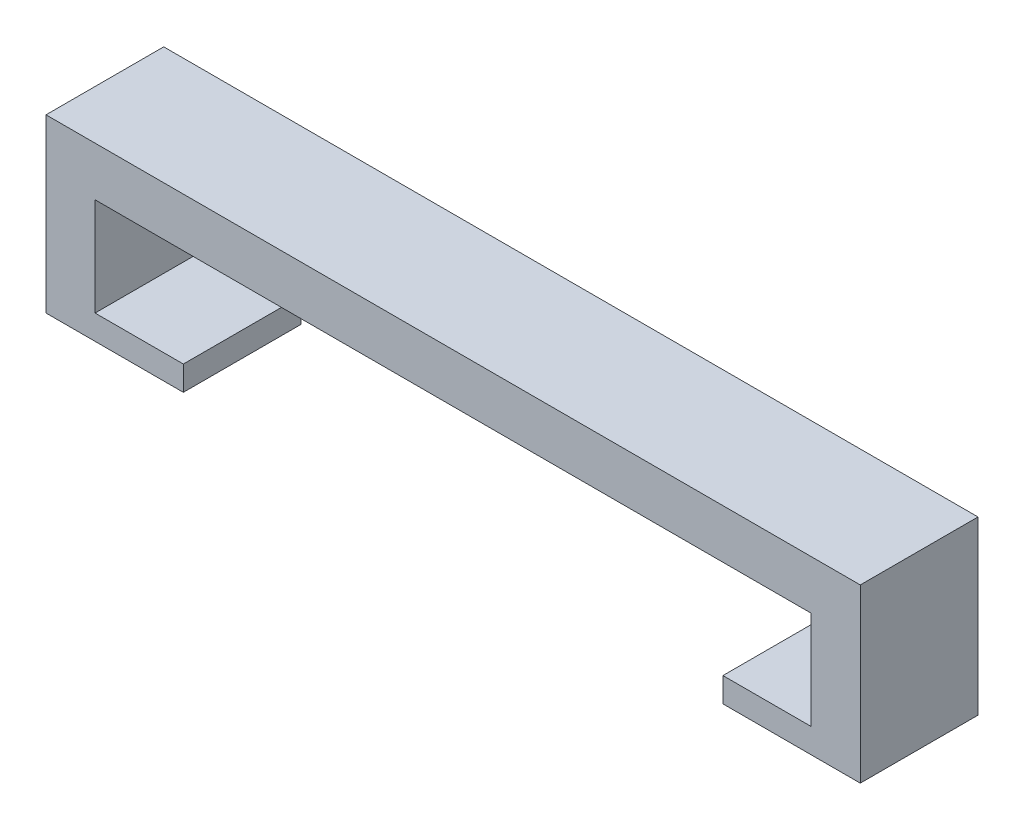
ISO-10303-21;
HEADER;
FILE_DESCRIPTION(('STEP AP214'),'2;1');
FILE_NAME('part.step','',(''),(''),'','','');
FILE_SCHEMA(('AUTOMOTIVE_DESIGN { 1 0 10303 214 1 1 1 1 }'));
ENDSEC;
DATA;
#1=APPLICATION_CONTEXT('core data for automotive mechanical design processes');
#2=APPLICATION_PROTOCOL_DEFINITION('international standard','automotive_design',2000,#1);
#3=PRODUCT_CONTEXT('',#1,'mechanical');
#4=PRODUCT('Part','Part','',(#3));
#5=PRODUCT_RELATED_PRODUCT_CATEGORY('part','',(#4));
#6=PRODUCT_DEFINITION_FORMATION('','',#4);
#7=PRODUCT_DEFINITION_CONTEXT('part definition',#1,'design');
#8=PRODUCT_DEFINITION('design','',#6,#7);
#9=PRODUCT_DEFINITION_SHAPE('','',#8);
#10=(LENGTH_UNIT() NAMED_UNIT(*) SI_UNIT(.MILLI.,.METRE.));
#11=(NAMED_UNIT(*) PLANE_ANGLE_UNIT() SI_UNIT($,.RADIAN.));
#12=(NAMED_UNIT(*) SI_UNIT($,.STERADIAN.) SOLID_ANGLE_UNIT());
#13=UNCERTAINTY_MEASURE_WITH_UNIT(LENGTH_MEASURE(1.E-05),#10,'distance_accuracy_value','');
#14=(GEOMETRIC_REPRESENTATION_CONTEXT(3) GLOBAL_UNCERTAINTY_ASSIGNED_CONTEXT((#13)) GLOBAL_UNIT_ASSIGNED_CONTEXT((#10,
#11,#12)) REPRESENTATION_CONTEXT('',''));
#15=CARTESIAN_POINT('',(0.,0.,0.));
#16=DIRECTION('',(0.,0.,1.));
#17=DIRECTION('',(1.,0.,0.));
#18=AXIS2_PLACEMENT_3D('',#15,#16,#17);
#19=CARTESIAN_POINT('',(4.20518496220181,-0.805698091460842,2.4));
#20=DIRECTION('',(0.,1.,0.));
#21=DIRECTION('',(0.,0.,1.));
#22=AXIS2_PLACEMENT_3D('',#19,#20,#21);
#23=PLANE('',#22);
#24=DIRECTION('',(1.,0.,0.));
#25=VECTOR('',#24,1.);
#26=CARTESIAN_POINT('',(4.20518496220181,-0.805698091460842,0.));
#27=LINE('',#26,#25);
#28=CARTESIAN_POINT('',(4.20518496220181,-0.805698091460842,0.));
#29=VERTEX_POINT('',#28);
#30=CARTESIAN_POINT('',(7.00518496220181,-0.805698091460842,0.));
#31=VERTEX_POINT('',#30);
#32=EDGE_CURVE('E159',#29,#31,#27,.T.);
#33=ORIENTED_EDGE('',*,*,#32,.T.);
#34=DIRECTION('',(0.,0.,-1.));
#35=VECTOR('',#34,1.);
#36=CARTESIAN_POINT('',(7.00518496220181,-0.805698091460842,2.4));
#37=LINE('',#36,#35);
#38=CARTESIAN_POINT('',(7.00518496220181,-0.805698091460842,2.4));
#39=VERTEX_POINT('',#38);
#40=EDGE_CURVE('E11',#39,#31,#37,.T.);
#41=ORIENTED_EDGE('',*,*,#40,.F.);
#42=DIRECTION('',(1.,0.,0.));
#43=VECTOR('',#42,1.);
#44=CARTESIAN_POINT('',(4.20518496220181,-0.805698091460842,2.4));
#45=LINE('',#44,#43);
#46=CARTESIAN_POINT('',(4.20518496220181,-0.805698091460842,2.4));
#47=VERTEX_POINT('',#46);
#48=EDGE_CURVE('E181',#47,#39,#45,.T.);
#49=ORIENTED_EDGE('',*,*,#48,.F.);
#50=DIRECTION('',(0.,0.,-1.));
#51=VECTOR('',#50,1.);
#52=CARTESIAN_POINT('',(4.20518496220181,-0.805698091460842,2.4));
#53=LINE('',#52,#51);
#54=EDGE_CURVE('E155',#47,#29,#53,.T.);
#55=ORIENTED_EDGE('',*,*,#54,.T.);
#56=EDGE_LOOP('',(#33,#41,#49,#55));
#57=FACE_BOUND('',#56,.T.);
#58=ADVANCED_FACE('F39',(#57),#23,.F.);
#59=CARTESIAN_POINT('',(7.00518496220181,2.69430190853916,2.4));
#60=DIRECTION('',(-1.,0.,0.));
#61=DIRECTION('',(0.,0.,1.));
#62=AXIS2_PLACEMENT_3D('',#59,#60,#61);
#63=PLANE('',#62);
#64=DIRECTION('',(0.,1.,0.));
#65=VECTOR('',#64,1.);
#66=CARTESIAN_POINT('',(7.00518496220181,2.69430190853916,0.));
#67=LINE('',#66,#65);
#68=CARTESIAN_POINT('',(7.00518496220181,2.69430190853916,0.));
#69=VERTEX_POINT('',#68);
#70=EDGE_CURVE('E162',#31,#69,#67,.T.);
#71=ORIENTED_EDGE('',*,*,#70,.T.);
#72=DIRECTION('',(0.,0.,-1.));
#73=VECTOR('',#72,1.);
#74=CARTESIAN_POINT('',(7.00518496220181,2.69430190853916,2.4));
#75=LINE('',#74,#73);
#76=CARTESIAN_POINT('',(7.00518496220181,2.69430190853916,2.4));
#77=VERTEX_POINT('',#76);
#78=EDGE_CURVE('E47',#77,#69,#75,.T.);
#79=ORIENTED_EDGE('',*,*,#78,.F.);
#80=DIRECTION('',(0.,1.,0.));
#81=VECTOR('',#80,1.);
#82=CARTESIAN_POINT('',(7.00518496220181,2.69430190853916,2.4));
#83=LINE('',#82,#81);
#84=EDGE_CURVE('E110',#39,#77,#83,.T.);
#85=ORIENTED_EDGE('',*,*,#84,.F.);
#86=ORIENTED_EDGE('',*,*,#40,.T.);
#87=EDGE_LOOP('',(#71,#79,#85,#86));
#88=FACE_BOUND('',#87,.T.);
#89=ADVANCED_FACE('F259',(#88),#63,.F.);
#90=CARTESIAN_POINT('',(-9.59481503779819,2.69430190853916,2.4));
#91=DIRECTION('',(0.,-1.,0.));
#92=DIRECTION('',(1.,0.,0.));
#93=AXIS2_PLACEMENT_3D('',#90,#91,#92);
#94=PLANE('',#93);
#95=DIRECTION('',(-1.,0.,0.));
#96=VECTOR('',#95,1.);
#97=CARTESIAN_POINT('',(-9.59481503779819,2.69430190853916,0.));
#98=LINE('',#97,#96);
#99=CARTESIAN_POINT('',(-9.59481503779819,2.69430190853916,0.));
#100=VERTEX_POINT('',#99);
#101=EDGE_CURVE('E164',#69,#100,#98,.T.);
#102=ORIENTED_EDGE('',*,*,#101,.T.);
#103=DIRECTION('',(0.,0.,-1.));
#104=VECTOR('',#103,1.);
#105=CARTESIAN_POINT('',(-9.59481503779819,2.69430190853916,2.4));
#106=LINE('',#105,#104);
#107=CARTESIAN_POINT('',(-9.59481503779819,2.69430190853916,2.4));
#108=VERTEX_POINT('',#107);
#109=EDGE_CURVE('E200',#108,#100,#106,.T.);
#110=ORIENTED_EDGE('',*,*,#109,.F.);
#111=DIRECTION('',(-1.,0.,0.));
#112=VECTOR('',#111,1.);
#113=CARTESIAN_POINT('',(-9.59481503779819,2.69430190853916,2.4));
#114=LINE('',#113,#112);
#115=EDGE_CURVE('E208',#77,#108,#114,.T.);
#116=ORIENTED_EDGE('',*,*,#115,.F.);
#117=ORIENTED_EDGE('',*,*,#78,.T.);
#118=EDGE_LOOP('',(#102,#110,#116,#117));
#119=FACE_BOUND('',#118,.T.);
#120=ADVANCED_FACE('F206',(#119),#94,.F.);
#121=CARTESIAN_POINT('',(-9.59481503779819,2.69430190853916,2.4));
#122=DIRECTION('',(1.,0.,0.));
#123=DIRECTION('',(0.,0.,-1.));
#124=AXIS2_PLACEMENT_3D('',#121,#122,#123);
#125=PLANE('',#124);
#126=DIRECTION('',(0.,-1.,0.));
#127=VECTOR('',#126,1.);
#128=CARTESIAN_POINT('',(-9.59481503779819,2.69430190853916,0.));
#129=LINE('',#128,#127);
#130=CARTESIAN_POINT('',(-9.59481503779819,-0.805698091460842,0.));
#131=VERTEX_POINT('',#130);
#132=EDGE_CURVE('E166',#100,#131,#129,.T.);
#133=ORIENTED_EDGE('',*,*,#132,.T.);
#134=DIRECTION('',(0.,0.,-1.));
#135=VECTOR('',#134,1.);
#136=CARTESIAN_POINT('',(-9.59481503779819,-0.805698091460842,2.4));
#137=LINE('',#136,#135);
#138=CARTESIAN_POINT('',(-9.59481503779819,-0.805698091460842,2.4));
#139=VERTEX_POINT('',#138);
#140=EDGE_CURVE('E197',#139,#131,#137,.T.);
#141=ORIENTED_EDGE('',*,*,#140,.F.);
#142=DIRECTION('',(0.,-1.,0.));
#143=VECTOR('',#142,1.);
#144=CARTESIAN_POINT('',(-9.59481503779819,2.69430190853916,2.4));
#145=LINE('',#144,#143);
#146=EDGE_CURVE('E226',#108,#139,#145,.T.);
#147=ORIENTED_EDGE('',*,*,#146,.F.);
#148=ORIENTED_EDGE('',*,*,#109,.T.);
#149=EDGE_LOOP('',(#133,#141,#147,#148));
#150=FACE_BOUND('',#149,.T.);
#151=ADVANCED_FACE('F217',(#150),#125,.F.);
#152=CARTESIAN_POINT('',(-9.59481503779819,-0.805698091460842,2.4));
#153=DIRECTION('',(0.,1.,0.));
#154=DIRECTION('',(0.,0.,1.));
#155=AXIS2_PLACEMENT_3D('',#152,#153,#154);
#156=PLANE('',#155);
#157=DIRECTION('',(1.,0.,0.));
#158=VECTOR('',#157,1.);
#159=CARTESIAN_POINT('',(-9.59481503779819,-0.805698091460842,0.));
#160=LINE('',#159,#158);
#161=CARTESIAN_POINT('',(-6.79481503779819,-0.805698091460842,0.));
#162=VERTEX_POINT('',#161);
#163=EDGE_CURVE('E168',#131,#162,#160,.T.);
#164=ORIENTED_EDGE('',*,*,#163,.T.);
#165=DIRECTION('',(0.,0.,-1.));
#166=VECTOR('',#165,1.);
#167=CARTESIAN_POINT('',(-6.79481503779819,-0.805698091460842,2.4));
#168=LINE('',#167,#166);
#169=CARTESIAN_POINT('',(-6.79481503779819,-0.805698091460842,2.4));
#170=VERTEX_POINT('',#169);
#171=EDGE_CURVE('E194',#170,#162,#168,.T.);
#172=ORIENTED_EDGE('',*,*,#171,.F.);
#173=DIRECTION('',(1.,0.,0.));
#174=VECTOR('',#173,1.);
#175=CARTESIAN_POINT('',(-9.59481503779819,-0.805698091460842,2.4));
#176=LINE('',#175,#174);
#177=EDGE_CURVE('E223',#139,#170,#176,.T.);
#178=ORIENTED_EDGE('',*,*,#177,.F.);
#179=ORIENTED_EDGE('',*,*,#140,.T.);
#180=EDGE_LOOP('',(#164,#172,#178,#179));
#181=FACE_BOUND('',#180,.T.);
#182=ADVANCED_FACE('F221',(#181),#156,.F.);
#183=CARTESIAN_POINT('',(-6.79481503779819,-0.305698091460842,2.4));
#184=DIRECTION('',(-1.,0.,0.));
#185=DIRECTION('',(0.,0.,1.));
#186=AXIS2_PLACEMENT_3D('',#183,#184,#185);
#187=PLANE('',#186);
#188=DIRECTION('',(0.,1.,0.));
#189=VECTOR('',#188,1.);
#190=CARTESIAN_POINT('',(-6.79481503779819,-0.305698091460842,0.));
#191=LINE('',#190,#189);
#192=CARTESIAN_POINT('',(-6.79481503779819,-0.305698091460842,0.));
#193=VERTEX_POINT('',#192);
#194=EDGE_CURVE('E170',#162,#193,#191,.T.);
#195=ORIENTED_EDGE('',*,*,#194,.T.);
#196=DIRECTION('',(0.,0.,-1.));
#197=VECTOR('',#196,1.);
#198=CARTESIAN_POINT('',(-6.79481503779819,-0.305698091460842,2.4));
#199=LINE('',#198,#197);
#200=CARTESIAN_POINT('',(-6.79481503779819,-0.305698091460842,2.4));
#201=VERTEX_POINT('',#200);
#202=EDGE_CURVE('E191',#201,#193,#199,.T.);
#203=ORIENTED_EDGE('',*,*,#202,.F.);
#204=DIRECTION('',(0.,1.,0.));
#205=VECTOR('',#204,1.);
#206=CARTESIAN_POINT('',(-6.79481503779819,-0.305698091460842,2.4));
#207=LINE('',#206,#205);
#208=EDGE_CURVE('E225',#170,#201,#207,.T.);
#209=ORIENTED_EDGE('',*,*,#208,.F.);
#210=ORIENTED_EDGE('',*,*,#171,.T.);
#211=EDGE_LOOP('',(#195,#203,#209,#210));
#212=FACE_BOUND('',#211,.T.);
#213=ADVANCED_FACE('F272',(#212),#187,.F.);
#214=CARTESIAN_POINT('',(-8.59481503779819,-0.305698091460842,2.4));
#215=DIRECTION('',(0.,-1.,0.));
#216=DIRECTION('',(0.,0.,-1.));
#217=AXIS2_PLACEMENT_3D('',#214,#215,#216);
#218=PLANE('',#217);
#219=DIRECTION('',(-1.,0.,0.));
#220=VECTOR('',#219,1.);
#221=CARTESIAN_POINT('',(-8.59481503779819,-0.305698091460842,0.));
#222=LINE('',#221,#220);
#223=CARTESIAN_POINT('',(-8.59481503779819,-0.305698091460842,0.));
#224=VERTEX_POINT('',#223);
#225=EDGE_CURVE('E172',#193,#224,#222,.T.);
#226=ORIENTED_EDGE('',*,*,#225,.T.);
#227=DIRECTION('',(0.,0.,-1.));
#228=VECTOR('',#227,1.);
#229=CARTESIAN_POINT('',(-8.59481503779819,-0.305698091460842,2.4));
#230=LINE('',#229,#228);
#231=CARTESIAN_POINT('',(-8.59481503779819,-0.305698091460842,2.4));
#232=VERTEX_POINT('',#231);
#233=EDGE_CURVE('E188',#232,#224,#230,.T.);
#234=ORIENTED_EDGE('',*,*,#233,.F.);
#235=DIRECTION('',(-1.,0.,0.));
#236=VECTOR('',#235,1.);
#237=CARTESIAN_POINT('',(-8.59481503779819,-0.305698091460842,2.4));
#238=LINE('',#237,#236);
#239=EDGE_CURVE('E228',#201,#232,#238,.T.);
#240=ORIENTED_EDGE('',*,*,#239,.F.);
#241=ORIENTED_EDGE('',*,*,#202,.T.);
#242=EDGE_LOOP('',(#226,#234,#240,#241));
#243=FACE_BOUND('',#242,.T.);
#244=ADVANCED_FACE('F275',(#243),#218,.F.);
#245=CARTESIAN_POINT('',(-8.59481503779819,1.69430190853916,2.4));
#246=DIRECTION('',(-1.,0.,0.));
#247=DIRECTION('',(0.,0.,1.));
#248=AXIS2_PLACEMENT_3D('',#245,#246,#247);
#249=PLANE('',#248);
#250=DIRECTION('',(0.,1.,0.));
#251=VECTOR('',#250,1.);
#252=CARTESIAN_POINT('',(-8.59481503779819,1.69430190853916,0.));
#253=LINE('',#252,#251);
#254=CARTESIAN_POINT('',(-8.59481503779819,1.69430190853916,0.));
#255=VERTEX_POINT('',#254);
#256=EDGE_CURVE('E174',#224,#255,#253,.T.);
#257=ORIENTED_EDGE('',*,*,#256,.T.);
#258=DIRECTION('',(0.,0.,-1.));
#259=VECTOR('',#258,1.);
#260=CARTESIAN_POINT('',(-8.59481503779819,1.69430190853916,2.4));
#261=LINE('',#260,#259);
#262=CARTESIAN_POINT('',(-8.59481503779819,1.69430190853916,2.4));
#263=VERTEX_POINT('',#262);
#264=EDGE_CURVE('E185',#263,#255,#261,.T.);
#265=ORIENTED_EDGE('',*,*,#264,.F.);
#266=DIRECTION('',(0.,1.,0.));
#267=VECTOR('',#266,1.);
#268=CARTESIAN_POINT('',(-8.59481503779819,1.69430190853916,2.4));
#269=LINE('',#268,#267);
#270=EDGE_CURVE('E234',#232,#263,#269,.T.);
#271=ORIENTED_EDGE('',*,*,#270,.F.);
#272=ORIENTED_EDGE('',*,*,#233,.T.);
#273=EDGE_LOOP('',(#257,#265,#271,#272));
#274=FACE_BOUND('',#273,.T.);
#275=ADVANCED_FACE('F240',(#274),#249,.F.);
#276=CARTESIAN_POINT('',(6.00518496220181,1.69430190853916,2.4));
#277=DIRECTION('',(0.,1.,0.));
#278=DIRECTION('',(-1.,0.,0.));
#279=AXIS2_PLACEMENT_3D('',#276,#277,#278);
#280=PLANE('',#279);
#281=DIRECTION('',(1.,0.,0.));
#282=VECTOR('',#281,1.);
#283=CARTESIAN_POINT('',(6.00518496220181,1.69430190853916,0.));
#284=LINE('',#283,#282);
#285=CARTESIAN_POINT('',(6.00518496220181,1.69430190853916,0.));
#286=VERTEX_POINT('',#285);
#287=EDGE_CURVE('E176',#255,#286,#284,.T.);
#288=ORIENTED_EDGE('',*,*,#287,.T.);
#289=DIRECTION('',(0.,0.,-1.));
#290=VECTOR('',#289,1.);
#291=CARTESIAN_POINT('',(6.00518496220181,1.69430190853916,2.4));
#292=LINE('',#291,#290);
#293=CARTESIAN_POINT('',(6.00518496220181,1.69430190853916,2.4));
#294=VERTEX_POINT('',#293);
#295=EDGE_CURVE('E150',#294,#286,#292,.T.);
#296=ORIENTED_EDGE('',*,*,#295,.F.);
#297=DIRECTION('',(1.,0.,0.));
#298=VECTOR('',#297,1.);
#299=CARTESIAN_POINT('',(6.00518496220181,1.69430190853916,2.4));
#300=LINE('',#299,#298);
#301=EDGE_CURVE('E141',#263,#294,#300,.T.);
#302=ORIENTED_EDGE('',*,*,#301,.F.);
#303=ORIENTED_EDGE('',*,*,#264,.T.);
#304=EDGE_LOOP('',(#288,#296,#302,#303));
#305=FACE_BOUND('',#304,.T.);
#306=ADVANCED_FACE('F244',(#305),#280,.F.);
#307=CARTESIAN_POINT('',(6.00518496220181,-0.305698091460842,2.4));
#308=DIRECTION('',(1.,0.,0.));
#309=DIRECTION('',(0.,0.,-1.));
#310=AXIS2_PLACEMENT_3D('',#307,#308,#309);
#311=PLANE('',#310);
#312=DIRECTION('',(0.,-1.,0.));
#313=VECTOR('',#312,1.);
#314=CARTESIAN_POINT('',(6.00518496220181,-0.305698091460842,0.));
#315=LINE('',#314,#313);
#316=CARTESIAN_POINT('',(6.00518496220181,-0.305698091460842,0.));
#317=VERTEX_POINT('',#316);
#318=EDGE_CURVE('E149',#286,#317,#315,.T.);
#319=ORIENTED_EDGE('',*,*,#318,.T.);
#320=DIRECTION('',(0.,0.,-1.));
#321=VECTOR('',#320,1.);
#322=CARTESIAN_POINT('',(6.00518496220181,-0.305698091460842,2.4));
#323=LINE('',#322,#321);
#324=CARTESIAN_POINT('',(6.00518496220181,-0.305698091460842,2.4));
#325=VERTEX_POINT('',#324);
#326=EDGE_CURVE('E146',#325,#317,#323,.T.);
#327=ORIENTED_EDGE('',*,*,#326,.F.);
#328=DIRECTION('',(0.,-1.,0.));
#329=VECTOR('',#328,1.);
#330=CARTESIAN_POINT('',(6.00518496220181,-0.305698091460842,2.4));
#331=LINE('',#330,#329);
#332=EDGE_CURVE('E135',#294,#325,#331,.T.);
#333=ORIENTED_EDGE('',*,*,#332,.F.);
#334=ORIENTED_EDGE('',*,*,#295,.T.);
#335=EDGE_LOOP('',(#319,#327,#333,#334));
#336=FACE_BOUND('',#335,.T.);
#337=ADVANCED_FACE('F147',(#336),#311,.F.);
#338=CARTESIAN_POINT('',(4.20518496220181,-0.305698091460842,2.4));
#339=DIRECTION('',(0.,-1.,0.));
#340=DIRECTION('',(0.,0.,-1.));
#341=AXIS2_PLACEMENT_3D('',#338,#339,#340);
#342=PLANE('',#341);
#343=DIRECTION('',(-1.,0.,0.));
#344=VECTOR('',#343,1.);
#345=CARTESIAN_POINT('',(4.20518496220181,-0.305698091460842,0.));
#346=LINE('',#345,#344);
#347=CARTESIAN_POINT('',(4.20518496220181,-0.305698091460842,0.));
#348=VERTEX_POINT('',#347);
#349=EDGE_CURVE('E96',#317,#348,#346,.T.);
#350=ORIENTED_EDGE('',*,*,#349,.T.);
#351=DIRECTION('',(0.,0.,-1.));
#352=VECTOR('',#351,1.);
#353=CARTESIAN_POINT('',(4.20518496220181,-0.305698091460842,2.4));
#354=LINE('',#353,#352);
#355=CARTESIAN_POINT('',(4.20518496220181,-0.305698091460842,2.4));
#356=VERTEX_POINT('',#355);
#357=EDGE_CURVE('E151',#356,#348,#354,.T.);
#358=ORIENTED_EDGE('',*,*,#357,.F.);
#359=DIRECTION('',(-1.,0.,0.));
#360=VECTOR('',#359,1.);
#361=CARTESIAN_POINT('',(4.20518496220181,-0.305698091460842,2.4));
#362=LINE('',#361,#360);
#363=EDGE_CURVE('E139',#325,#356,#362,.T.);
#364=ORIENTED_EDGE('',*,*,#363,.F.);
#365=ORIENTED_EDGE('',*,*,#326,.T.);
#366=EDGE_LOOP('',(#350,#358,#364,#365));
#367=FACE_BOUND('',#366,.T.);
#368=ADVANCED_FACE('F153',(#367),#342,.F.);
#369=CARTESIAN_POINT('',(4.20518496220181,-0.805698091460842,2.4));
#370=DIRECTION('',(1.,0.,0.));
#371=DIRECTION('',(0.,0.,-1.));
#372=AXIS2_PLACEMENT_3D('',#369,#370,#371);
#373=PLANE('',#372);
#374=DIRECTION('',(0.,-1.,0.));
#375=VECTOR('',#374,1.);
#376=CARTESIAN_POINT('',(4.20518496220181,-0.805698091460842,0.));
#377=LINE('',#376,#375);
#378=EDGE_CURVE('E102',#348,#29,#377,.T.);
#379=ORIENTED_EDGE('',*,*,#378,.T.);
#380=ORIENTED_EDGE('',*,*,#54,.F.);
#381=DIRECTION('',(0.,-1.,0.));
#382=VECTOR('',#381,1.);
#383=CARTESIAN_POINT('',(4.20518496220181,-0.805698091460842,2.4));
#384=LINE('',#383,#382);
#385=EDGE_CURVE('E55',#356,#47,#384,.T.);
#386=ORIENTED_EDGE('',*,*,#385,.F.);
#387=ORIENTED_EDGE('',*,*,#357,.T.);
#388=EDGE_LOOP('',(#379,#380,#386,#387));
#389=FACE_BOUND('',#388,.T.);
#390=ADVANCED_FACE('F248',(#389),#373,.F.);
#391=CARTESIAN_POINT('',(0.,0.,2.4));
#392=DIRECTION('',(0.,0.,-1.));
#393=DIRECTION('',(-1.,0.,0.));
#394=AXIS2_PLACEMENT_3D('',#391,#392,#393);
#395=PLANE('',#394);
#396=ORIENTED_EDGE('',*,*,#48,.T.);
#397=ORIENTED_EDGE('',*,*,#84,.T.);
#398=ORIENTED_EDGE('',*,*,#115,.T.);
#399=ORIENTED_EDGE('',*,*,#146,.T.);
#400=ORIENTED_EDGE('',*,*,#177,.T.);
#401=ORIENTED_EDGE('',*,*,#208,.T.);
#402=ORIENTED_EDGE('',*,*,#239,.T.);
#403=ORIENTED_EDGE('',*,*,#270,.T.);
#404=ORIENTED_EDGE('',*,*,#301,.T.);
#405=ORIENTED_EDGE('',*,*,#332,.T.);
#406=ORIENTED_EDGE('',*,*,#363,.T.);
#407=ORIENTED_EDGE('',*,*,#385,.T.);
#408=EDGE_LOOP('',(#396,#397,#398,#399,#400,#401,#402,#403,#404,#405,#406,#407));
#409=FACE_BOUND('',#408,.T.);
#410=ADVANCED_FACE('F137',(#409),#395,.F.);
#411=CARTESIAN_POINT('',(0.,0.,0.));
#412=DIRECTION('',(0.,0.,-1.));
#413=DIRECTION('',(-1.,0.,0.));
#414=AXIS2_PLACEMENT_3D('',#411,#412,#413);
#415=PLANE('',#414);
#416=ORIENTED_EDGE('',*,*,#32,.F.);
#417=ORIENTED_EDGE('',*,*,#378,.F.);
#418=ORIENTED_EDGE('',*,*,#349,.F.);
#419=ORIENTED_EDGE('',*,*,#318,.F.);
#420=ORIENTED_EDGE('',*,*,#287,.F.);
#421=ORIENTED_EDGE('',*,*,#256,.F.);
#422=ORIENTED_EDGE('',*,*,#225,.F.);
#423=ORIENTED_EDGE('',*,*,#194,.F.);
#424=ORIENTED_EDGE('',*,*,#163,.F.);
#425=ORIENTED_EDGE('',*,*,#132,.F.);
#426=ORIENTED_EDGE('',*,*,#101,.F.);
#427=ORIENTED_EDGE('',*,*,#70,.F.);
#428=EDGE_LOOP('',(#416,#417,#418,#419,#420,#421,#422,#423,#424,#425,#426,#427));
#429=FACE_BOUND('',#428,.T.);
#430=ADVANCED_FACE('F212',(#429),#415,.T.);
#431=CLOSED_SHELL('',(#58,#89,#120,#151,#182,#213,#244,#275,#306,#337,#368,#390,#410,#430));
#432=MANIFOLD_SOLID_BREP('B2',#431);
#433=ADVANCED_BREP_SHAPE_REPRESENTATION('',(#18,#432),#14);
#434=SHAPE_DEFINITION_REPRESENTATION(#9,#433);
ENDSEC;
END-ISO-10303-21;
